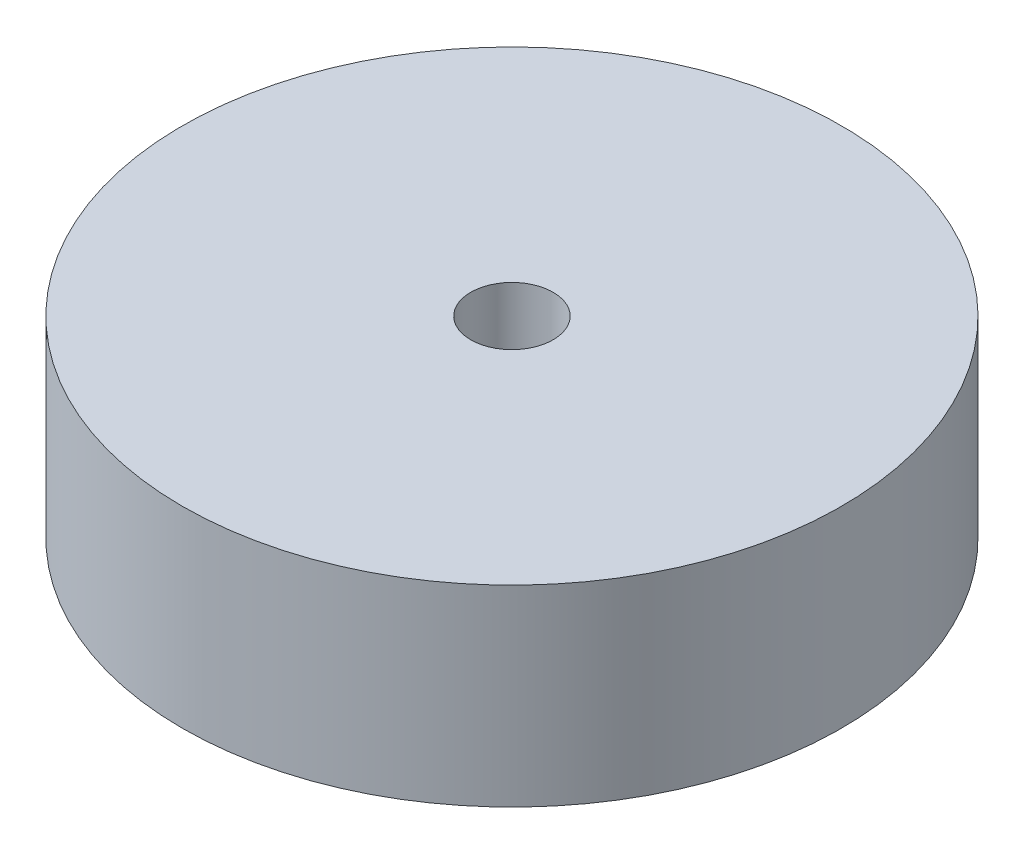
ISO-10303-21;
HEADER;
FILE_DESCRIPTION(('STEP AP214'),'2;1');
FILE_NAME('part.step','',(''),(''),'','','');
FILE_SCHEMA(('AUTOMOTIVE_DESIGN { 1 0 10303 214 1 1 1 1 }'));
ENDSEC;
DATA;
#1=APPLICATION_CONTEXT('core data for automotive mechanical design processes');
#2=APPLICATION_PROTOCOL_DEFINITION('international standard','automotive_design',2000,#1);
#3=PRODUCT_CONTEXT('',#1,'mechanical');
#4=PRODUCT('Part','Part','',(#3));
#5=PRODUCT_RELATED_PRODUCT_CATEGORY('part','',(#4));
#6=PRODUCT_DEFINITION_FORMATION('','',#4);
#7=PRODUCT_DEFINITION_CONTEXT('part definition',#1,'design');
#8=PRODUCT_DEFINITION('design','',#6,#7);
#9=PRODUCT_DEFINITION_SHAPE('','',#8);
#10=(LENGTH_UNIT() NAMED_UNIT(*) SI_UNIT(.MILLI.,.METRE.));
#11=(NAMED_UNIT(*) PLANE_ANGLE_UNIT() SI_UNIT($,.RADIAN.));
#12=(NAMED_UNIT(*) SI_UNIT($,.STERADIAN.) SOLID_ANGLE_UNIT());
#13=UNCERTAINTY_MEASURE_WITH_UNIT(LENGTH_MEASURE(1.E-05),#10,'distance_accuracy_value','');
#14=(GEOMETRIC_REPRESENTATION_CONTEXT(3) GLOBAL_UNCERTAINTY_ASSIGNED_CONTEXT((#13)) GLOBAL_UNIT_ASSIGNED_CONTEXT((#10,
#11,#12)) REPRESENTATION_CONTEXT('',''));
#15=CARTESIAN_POINT('',(0.,0.,0.));
#16=DIRECTION('',(0.,0.,1.));
#17=DIRECTION('',(1.,0.,0.));
#18=AXIS2_PLACEMENT_3D('',#15,#16,#17);
#19=CARTESIAN_POINT('',(76.2,44.45,0.));
#20=DIRECTION('',(0.,-1.,0.));
#21=DIRECTION('',(0.,0.,-1.));
#22=AXIS2_PLACEMENT_3D('',#19,#20,#21);
#23=PLANE('',#22);
#24=CARTESIAN_POINT('',(0.,44.45,0.));
#25=DIRECTION('',(0.,1.,0.));
#26=DIRECTION('',(0.,0.,1.));
#27=AXIS2_PLACEMENT_3D('',#24,#25,#26);
#28=CIRCLE('',#27,9.52499999999999);
#29=CARTESIAN_POINT('',(0.,44.45,9.52499999999999));
#30=VERTEX_POINT('',#29);
#31=EDGE_CURVE('E10',#30,#30,#28,.T.);
#32=ORIENTED_EDGE('',*,*,#31,.F.);
#33=EDGE_LOOP('',(#32));
#34=FACE_BOUND('',#33,.T.);
#35=CARTESIAN_POINT('',(0.,44.45,0.));
#36=DIRECTION('',(0.,1.,0.));
#37=DIRECTION('',(0.,0.,1.));
#38=AXIS2_PLACEMENT_3D('',#35,#36,#37);
#39=CIRCLE('',#38,76.2);
#40=CARTESIAN_POINT('',(0.,44.45,76.2));
#41=VERTEX_POINT('',#40);
#42=EDGE_CURVE('E80',#41,#41,#39,.T.);
#43=ORIENTED_EDGE('',*,*,#42,.T.);
#44=EDGE_LOOP('',(#43));
#45=FACE_BOUND('',#44,.T.);
#46=ADVANCED_FACE('F37',(#34,#45),#23,.F.);
#47=CARTESIAN_POINT('',(0.,0.,0.));
#48=DIRECTION('',(0.,1.,0.));
#49=DIRECTION('',(0.,0.,1.));
#50=AXIS2_PLACEMENT_3D('',#47,#48,#49);
#51=CYLINDRICAL_SURFACE('',#50,9.52499999999999);
#52=CARTESIAN_POINT('',(0.,25.4,0.));
#53=DIRECTION('',(0.,1.,0.));
#54=DIRECTION('',(0.,0.,1.));
#55=AXIS2_PLACEMENT_3D('',#52,#53,#54);
#56=CIRCLE('',#55,9.525);
#57=CARTESIAN_POINT('',(0.,25.4,9.525));
#58=VERTEX_POINT('',#57);
#59=EDGE_CURVE('E44',#58,#58,#56,.T.);
#60=ORIENTED_EDGE('',*,*,#59,.F.);
#61=EDGE_LOOP('',(#60));
#62=FACE_BOUND('',#61,.T.);
#63=ORIENTED_EDGE('',*,*,#31,.T.);
#64=EDGE_LOOP('',(#63));
#65=FACE_BOUND('',#64,.T.);
#66=ADVANCED_FACE('F130',(#62,#65),#51,.F.);
#67=CARTESIAN_POINT('',(9.525,25.4,0.));
#68=DIRECTION('',(0.,1.,0.));
#69=DIRECTION('',(0.,0.,1.));
#70=AXIS2_PLACEMENT_3D('',#67,#68,#69);
#71=PLANE('',#70);
#72=CARTESIAN_POINT('',(0.,25.4,0.));
#73=DIRECTION('',(0.,1.,0.));
#74=DIRECTION('',(0.,0.,1.));
#75=AXIS2_PLACEMENT_3D('',#72,#73,#74);
#76=CIRCLE('',#75,31.75);
#77=CARTESIAN_POINT('',(0.,25.4,31.75));
#78=VERTEX_POINT('',#77);
#79=EDGE_CURVE('E49',#78,#78,#76,.T.);
#80=ORIENTED_EDGE('',*,*,#79,.F.);
#81=EDGE_LOOP('',(#80));
#82=FACE_BOUND('',#81,.T.);
#83=ORIENTED_EDGE('',*,*,#59,.T.);
#84=EDGE_LOOP('',(#83));
#85=FACE_BOUND('',#84,.T.);
#86=ADVANCED_FACE('F125',(#82,#85),#71,.F.);
#87=CARTESIAN_POINT('',(0.,0.,0.));
#88=DIRECTION('',(0.,1.,0.));
#89=DIRECTION('',(0.,0.,1.));
#90=AXIS2_PLACEMENT_3D('',#87,#88,#89);
#91=CYLINDRICAL_SURFACE('',#90,31.75);
#92=CARTESIAN_POINT('',(0.,15.24,0.));
#93=DIRECTION('',(0.,1.,0.));
#94=DIRECTION('',(0.,0.,1.));
#95=AXIS2_PLACEMENT_3D('',#92,#93,#94);
#96=CIRCLE('',#95,31.75);
#97=CARTESIAN_POINT('',(0.,15.24,31.75));
#98=VERTEX_POINT('',#97);
#99=EDGE_CURVE('E54',#98,#98,#96,.T.);
#100=ORIENTED_EDGE('',*,*,#99,.F.);
#101=EDGE_LOOP('',(#100));
#102=FACE_BOUND('',#101,.T.);
#103=ORIENTED_EDGE('',*,*,#79,.T.);
#104=EDGE_LOOP('',(#103));
#105=FACE_BOUND('',#104,.T.);
#106=ADVANCED_FACE('F119',(#102,#105),#91,.F.);
#107=CARTESIAN_POINT('',(31.75,15.24,0.));
#108=DIRECTION('',(0.,1.,0.));
#109=DIRECTION('',(0.,0.,1.));
#110=AXIS2_PLACEMENT_3D('',#107,#108,#109);
#111=PLANE('',#110);
#112=CARTESIAN_POINT('',(0.,15.24,0.));
#113=DIRECTION('',(0.,1.,0.));
#114=DIRECTION('',(0.,0.,1.));
#115=AXIS2_PLACEMENT_3D('',#112,#113,#114);
#116=CIRCLE('',#115,38.1);
#117=CARTESIAN_POINT('',(0.,15.24,38.1));
#118=VERTEX_POINT('',#117);
#119=EDGE_CURVE('E60',#118,#118,#116,.T.);
#120=ORIENTED_EDGE('',*,*,#119,.F.);
#121=EDGE_LOOP('',(#120));
#122=FACE_BOUND('',#121,.T.);
#123=ORIENTED_EDGE('',*,*,#99,.T.);
#124=EDGE_LOOP('',(#123));
#125=FACE_BOUND('',#124,.T.);
#126=ADVANCED_FACE('F113',(#122,#125),#111,.F.);
#127=CARTESIAN_POINT('',(0.,0.,0.));
#128=DIRECTION('',(0.,1.,0.));
#129=DIRECTION('',(0.,0.,1.));
#130=AXIS2_PLACEMENT_3D('',#127,#128,#129);
#131=CYLINDRICAL_SURFACE('',#130,38.1);
#132=CARTESIAN_POINT('',(0.,8.89,0.));
#133=DIRECTION('',(0.,1.,0.));
#134=DIRECTION('',(0.,0.,1.));
#135=AXIS2_PLACEMENT_3D('',#132,#133,#134);
#136=CIRCLE('',#135,38.1);
#137=CARTESIAN_POINT('',(0.,8.89,38.1));
#138=VERTEX_POINT('',#137);
#139=EDGE_CURVE('E64',#138,#138,#136,.T.);
#140=ORIENTED_EDGE('',*,*,#139,.F.);
#141=EDGE_LOOP('',(#140));
#142=FACE_BOUND('',#141,.T.);
#143=ORIENTED_EDGE('',*,*,#119,.T.);
#144=EDGE_LOOP('',(#143));
#145=FACE_BOUND('',#144,.T.);
#146=ADVANCED_FACE('F107',(#142,#145),#131,.F.);
#147=CARTESIAN_POINT('',(38.1,8.89,0.));
#148=DIRECTION('',(0.,1.,0.));
#149=DIRECTION('',(0.,0.,1.));
#150=AXIS2_PLACEMENT_3D('',#147,#148,#149);
#151=PLANE('',#150);
#152=CARTESIAN_POINT('',(0.,8.89,0.));
#153=DIRECTION('',(0.,1.,0.));
#154=DIRECTION('',(0.,0.,1.));
#155=AXIS2_PLACEMENT_3D('',#152,#153,#154);
#156=CIRCLE('',#155,57.15);
#157=CARTESIAN_POINT('',(0.,8.89,57.15));
#158=VERTEX_POINT('',#157);
#159=EDGE_CURVE('E68',#158,#158,#156,.T.);
#160=ORIENTED_EDGE('',*,*,#159,.F.);
#161=EDGE_LOOP('',(#160));
#162=FACE_BOUND('',#161,.T.);
#163=ORIENTED_EDGE('',*,*,#139,.T.);
#164=EDGE_LOOP('',(#163));
#165=FACE_BOUND('',#164,.T.);
#166=ADVANCED_FACE('F101',(#162,#165),#151,.F.);
#167=CARTESIAN_POINT('',(0.,0.,0.));
#168=DIRECTION('',(0.,1.,0.));
#169=DIRECTION('',(0.,0.,1.));
#170=AXIS2_PLACEMENT_3D('',#167,#168,#169);
#171=CYLINDRICAL_SURFACE('',#170,57.15);
#172=CARTESIAN_POINT('',(0.,0.,0.));
#173=DIRECTION('',(0.,1.,0.));
#174=DIRECTION('',(0.,0.,1.));
#175=AXIS2_PLACEMENT_3D('',#172,#173,#174);
#176=CIRCLE('',#175,57.15);
#177=CARTESIAN_POINT('',(0.,0.,57.15));
#178=VERTEX_POINT('',#177);
#179=EDGE_CURVE('E72',#178,#178,#176,.T.);
#180=ORIENTED_EDGE('',*,*,#179,.F.);
#181=EDGE_LOOP('',(#180));
#182=FACE_BOUND('',#181,.T.);
#183=ORIENTED_EDGE('',*,*,#159,.T.);
#184=EDGE_LOOP('',(#183));
#185=FACE_BOUND('',#184,.T.);
#186=ADVANCED_FACE('F95',(#182,#185),#171,.F.);
#187=CARTESIAN_POINT('',(57.15,0.,0.));
#188=DIRECTION('',(0.,1.,0.));
#189=DIRECTION('',(0.,0.,1.));
#190=AXIS2_PLACEMENT_3D('',#187,#188,#189);
#191=PLANE('',#190);
#192=CARTESIAN_POINT('',(0.,0.,0.));
#193=DIRECTION('',(0.,1.,0.));
#194=DIRECTION('',(0.,0.,1.));
#195=AXIS2_PLACEMENT_3D('',#192,#193,#194);
#196=CIRCLE('',#195,76.2);
#197=CARTESIAN_POINT('',(0.,0.,76.2));
#198=VERTEX_POINT('',#197);
#199=EDGE_CURVE('E76',#198,#198,#196,.T.);
#200=ORIENTED_EDGE('',*,*,#199,.F.);
#201=EDGE_LOOP('',(#200));
#202=FACE_BOUND('',#201,.T.);
#203=ORIENTED_EDGE('',*,*,#179,.T.);
#204=EDGE_LOOP('',(#203));
#205=FACE_BOUND('',#204,.T.);
#206=ADVANCED_FACE('F89',(#202,#205),#191,.F.);
#207=CARTESIAN_POINT('',(0.,0.,0.));
#208=DIRECTION('',(0.,1.,0.));
#209=DIRECTION('',(0.,0.,1.));
#210=AXIS2_PLACEMENT_3D('',#207,#208,#209);
#211=CYLINDRICAL_SURFACE('',#210,76.2);
#212=ORIENTED_EDGE('',*,*,#42,.F.);
#213=EDGE_LOOP('',(#212));
#214=FACE_BOUND('',#213,.T.);
#215=ORIENTED_EDGE('',*,*,#199,.T.);
#216=EDGE_LOOP('',(#215));
#217=FACE_BOUND('',#216,.T.);
#218=ADVANCED_FACE('F86',(#214,#217),#211,.T.);
#219=CLOSED_SHELL('',(#46,#66,#86,#106,#126,#146,#166,#186,#206,#218));
#220=MANIFOLD_SOLID_BREP('B2',#219);
#221=ADVANCED_BREP_SHAPE_REPRESENTATION('',(#18,#220),#14);
#222=SHAPE_DEFINITION_REPRESENTATION(#9,#221);
ENDSEC;
END-ISO-10303-21;
